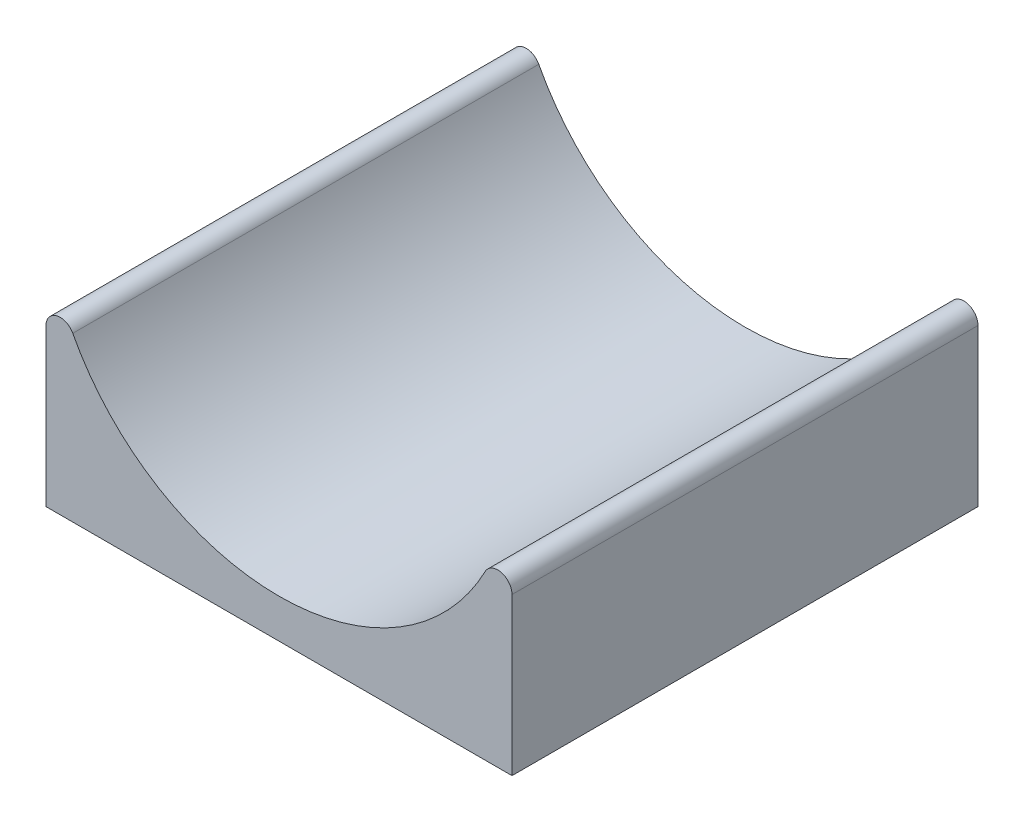
ISO-10303-21;
HEADER;
FILE_DESCRIPTION(('STEP AP214'),'2;1');
FILE_NAME('part.step','',(''),(''),'','','');
FILE_SCHEMA(('AUTOMOTIVE_DESIGN { 1 0 10303 214 1 1 1 1 }'));
ENDSEC;
DATA;
#1=APPLICATION_CONTEXT('core data for automotive mechanical design processes');
#2=APPLICATION_PROTOCOL_DEFINITION('international standard','automotive_design',2000,#1);
#3=PRODUCT_CONTEXT('',#1,'mechanical');
#4=PRODUCT('Part','Part','',(#3));
#5=PRODUCT_RELATED_PRODUCT_CATEGORY('part','',(#4));
#6=PRODUCT_DEFINITION_FORMATION('','',#4);
#7=PRODUCT_DEFINITION_CONTEXT('part definition',#1,'design');
#8=PRODUCT_DEFINITION('design','',#6,#7);
#9=PRODUCT_DEFINITION_SHAPE('','',#8);
#10=(LENGTH_UNIT() NAMED_UNIT(*) SI_UNIT(.MILLI.,.METRE.));
#11=(NAMED_UNIT(*) PLANE_ANGLE_UNIT() SI_UNIT($,.RADIAN.));
#12=(NAMED_UNIT(*) SI_UNIT($,.STERADIAN.) SOLID_ANGLE_UNIT());
#13=UNCERTAINTY_MEASURE_WITH_UNIT(LENGTH_MEASURE(1.E-05),#10,'distance_accuracy_value','');
#14=(GEOMETRIC_REPRESENTATION_CONTEXT(3) GLOBAL_UNCERTAINTY_ASSIGNED_CONTEXT((#13)) GLOBAL_UNIT_ASSIGNED_CONTEXT((#10,
#11,#12)) REPRESENTATION_CONTEXT('',''));
#15=CARTESIAN_POINT('',(0.,0.,0.));
#16=DIRECTION('',(0.,0.,1.));
#17=DIRECTION('',(1.,0.,0.));
#18=AXIS2_PLACEMENT_3D('',#15,#16,#17);
#19=CARTESIAN_POINT('',(-19.558,-10.2862160195088,41.656));
#20=DIRECTION('',(0.,0.,-1.));
#21=DIRECTION('',(-1.,0.,0.));
#22=AXIS2_PLACEMENT_3D('',#19,#20,#21);
#23=CYLINDRICAL_SURFACE('',#22,1.27);
#24=CARTESIAN_POINT('',(-19.558,-10.2862160195088,0.));
#25=DIRECTION('',(0.,0.,1.));
#26=DIRECTION('',(-1.,0.,0.));
#27=AXIS2_PLACEMENT_3D('',#24,#25,#26);
#28=CIRCLE('',#27,1.27);
#29=CARTESIAN_POINT('',(-18.4339770114943,-9.69505417930716,0.));
#30=VERTEX_POINT('',#29);
#31=CARTESIAN_POINT('',(-20.828,-10.2862160195088,0.));
#32=VERTEX_POINT('',#31);
#33=EDGE_CURVE('E117',#30,#32,#28,.T.);
#34=ORIENTED_EDGE('',*,*,#33,.T.);
#35=DIRECTION('',(0.,0.,-1.));
#36=VECTOR('',#35,1.);
#37=CARTESIAN_POINT('',(-20.828,-10.2862160195088,41.656));
#38=LINE('',#37,#36);
#39=CARTESIAN_POINT('',(-20.828,-10.2862160195088,41.656));
#40=VERTEX_POINT('',#39);
#41=EDGE_CURVE('E11',#40,#32,#38,.T.);
#42=ORIENTED_EDGE('',*,*,#41,.F.);
#43=CARTESIAN_POINT('',(-19.558,-10.2862160195088,41.656));
#44=DIRECTION('',(0.,0.,1.));
#45=DIRECTION('',(-1.,0.,0.));
#46=AXIS2_PLACEMENT_3D('',#43,#44,#45);
#47=CIRCLE('',#46,1.27);
#48=CARTESIAN_POINT('',(-18.4339770114943,-9.69505417930716,41.656));
#49=VERTEX_POINT('',#48);
#50=EDGE_CURVE('E127',#49,#40,#47,.T.);
#51=ORIENTED_EDGE('',*,*,#50,.F.);
#52=DIRECTION('',(0.,0.,-1.));
#53=VECTOR('',#52,1.);
#54=CARTESIAN_POINT('',(-18.4339770114943,-9.69505417930716,41.656));
#55=LINE('',#54,#53);
#56=EDGE_CURVE('E113',#49,#30,#55,.T.);
#57=ORIENTED_EDGE('',*,*,#56,.T.);
#58=EDGE_LOOP('',(#34,#42,#51,#57));
#59=FACE_BOUND('',#58,.T.);
#60=ADVANCED_FACE('F33',(#59),#23,.T.);
#61=CARTESIAN_POINT('',(-20.828,-10.2862160195088,41.656));
#62=DIRECTION('',(1.,0.,0.));
#63=DIRECTION('',(0.,0.,-1.));
#64=AXIS2_PLACEMENT_3D('',#61,#62,#63);
#65=PLANE('',#64);
#66=DIRECTION('',(0.,-1.,0.));
#67=VECTOR('',#66,1.);
#68=CARTESIAN_POINT('',(-20.828,-10.2862160195088,0.));
#69=LINE('',#68,#67);
#70=CARTESIAN_POINT('',(-20.828,-24.3086232060066,0.));
#71=VERTEX_POINT('',#70);
#72=EDGE_CURVE('E120',#32,#71,#69,.T.);
#73=ORIENTED_EDGE('',*,*,#72,.T.);
#74=DIRECTION('',(0.,0.,-1.));
#75=VECTOR('',#74,1.);
#76=CARTESIAN_POINT('',(-20.828,-24.3086232060066,41.656));
#77=LINE('',#76,#75);
#78=CARTESIAN_POINT('',(-20.828,-24.3086232060066,41.656));
#79=VERTEX_POINT('',#78);
#80=EDGE_CURVE('E41',#79,#71,#77,.T.);
#81=ORIENTED_EDGE('',*,*,#80,.F.);
#82=DIRECTION('',(0.,-1.,0.));
#83=VECTOR('',#82,1.);
#84=CARTESIAN_POINT('',(-20.828,-10.2862160195088,41.656));
#85=LINE('',#84,#83);
#86=EDGE_CURVE('E86',#40,#79,#85,.T.);
#87=ORIENTED_EDGE('',*,*,#86,.F.);
#88=ORIENTED_EDGE('',*,*,#41,.T.);
#89=EDGE_LOOP('',(#73,#81,#87,#88));
#90=FACE_BOUND('',#89,.T.);
#91=ADVANCED_FACE('F151',(#90),#65,.F.);
#92=CARTESIAN_POINT('',(-20.828,-24.3086232060066,41.656));
#93=DIRECTION('',(0.,1.,0.));
#94=DIRECTION('',(0.,0.,1.));
#95=AXIS2_PLACEMENT_3D('',#92,#93,#94);
#96=PLANE('',#95);
#97=DIRECTION('',(1.,0.,0.));
#98=VECTOR('',#97,1.);
#99=CARTESIAN_POINT('',(-20.828,-24.3086232060066,0.));
#100=LINE('',#99,#98);
#101=CARTESIAN_POINT('',(20.828,-24.3086232060066,0.));
#102=VERTEX_POINT('',#101);
#103=EDGE_CURVE('E122',#71,#102,#100,.T.);
#104=ORIENTED_EDGE('',*,*,#103,.T.);
#105=DIRECTION('',(0.,0.,-1.));
#106=VECTOR('',#105,1.);
#107=CARTESIAN_POINT('',(20.828,-24.3086232060066,41.656));
#108=LINE('',#107,#106);
#109=CARTESIAN_POINT('',(20.828,-24.3086232060066,41.656));
#110=VERTEX_POINT('',#109);
#111=EDGE_CURVE('E108',#110,#102,#108,.T.);
#112=ORIENTED_EDGE('',*,*,#111,.F.);
#113=DIRECTION('',(1.,0.,0.));
#114=VECTOR('',#113,1.);
#115=CARTESIAN_POINT('',(-20.828,-24.3086232060066,41.656));
#116=LINE('',#115,#114);
#117=EDGE_CURVE('E99',#79,#110,#116,.T.);
#118=ORIENTED_EDGE('',*,*,#117,.F.);
#119=ORIENTED_EDGE('',*,*,#80,.T.);
#120=EDGE_LOOP('',(#104,#112,#118,#119));
#121=FACE_BOUND('',#120,.T.);
#122=ADVANCED_FACE('F133',(#121),#96,.F.);
#123=CARTESIAN_POINT('',(20.828,-24.3086232060066,41.656));
#124=DIRECTION('',(-1.,0.,0.));
#125=DIRECTION('',(0.,0.,1.));
#126=AXIS2_PLACEMENT_3D('',#123,#124,#125);
#127=PLANE('',#126);
#128=DIRECTION('',(0.,1.,0.));
#129=VECTOR('',#128,1.);
#130=CARTESIAN_POINT('',(20.828,-24.3086232060066,0.));
#131=LINE('',#130,#129);
#132=CARTESIAN_POINT('',(20.828,-10.2862160195088,0.));
#133=VERTEX_POINT('',#132);
#134=EDGE_CURVE('E107',#102,#133,#131,.T.);
#135=ORIENTED_EDGE('',*,*,#134,.T.);
#136=DIRECTION('',(0.,0.,-1.));
#137=VECTOR('',#136,1.);
#138=CARTESIAN_POINT('',(20.828,-10.2862160195088,41.656));
#139=LINE('',#138,#137);
#140=CARTESIAN_POINT('',(20.828,-10.2862160195088,41.656));
#141=VERTEX_POINT('',#140);
#142=EDGE_CURVE('E104',#141,#133,#139,.T.);
#143=ORIENTED_EDGE('',*,*,#142,.F.);
#144=DIRECTION('',(0.,1.,0.));
#145=VECTOR('',#144,1.);
#146=CARTESIAN_POINT('',(20.828,-24.3086232060066,41.656));
#147=LINE('',#146,#145);
#148=EDGE_CURVE('E93',#110,#141,#147,.T.);
#149=ORIENTED_EDGE('',*,*,#148,.F.);
#150=ORIENTED_EDGE('',*,*,#111,.T.);
#151=EDGE_LOOP('',(#135,#143,#149,#150));
#152=FACE_BOUND('',#151,.T.);
#153=ADVANCED_FACE('F105',(#152),#127,.F.);
#154=CARTESIAN_POINT('',(19.558,-10.2862160195088,41.656));
#155=DIRECTION('',(0.,0.,-1.));
#156=DIRECTION('',(-1.,0.,0.));
#157=AXIS2_PLACEMENT_3D('',#154,#155,#156);
#158=CYLINDRICAL_SURFACE('',#157,1.27);
#159=CARTESIAN_POINT('',(19.558,-10.2862160195088,0.));
#160=DIRECTION('',(0.,0.,1.));
#161=DIRECTION('',(1.,0.,0.));
#162=AXIS2_PLACEMENT_3D('',#159,#160,#161);
#163=CIRCLE('',#162,1.27);
#164=CARTESIAN_POINT('',(18.4339770114942,-9.69505417930717,0.));
#165=VERTEX_POINT('',#164);
#166=EDGE_CURVE('E72',#133,#165,#163,.T.);
#167=ORIENTED_EDGE('',*,*,#166,.T.);
#168=DIRECTION('',(0.,0.,-1.));
#169=VECTOR('',#168,1.);
#170=CARTESIAN_POINT('',(18.4339770114942,-9.69505417930717,41.656));
#171=LINE('',#170,#169);
#172=CARTESIAN_POINT('',(18.4339770114942,-9.69505417930717,41.656));
#173=VERTEX_POINT('',#172);
#174=EDGE_CURVE('E109',#173,#165,#171,.T.);
#175=ORIENTED_EDGE('',*,*,#174,.F.);
#176=CARTESIAN_POINT('',(19.558,-10.2862160195088,41.656));
#177=DIRECTION('',(0.,0.,1.));
#178=DIRECTION('',(1.,0.,0.));
#179=AXIS2_PLACEMENT_3D('',#176,#177,#178);
#180=CIRCLE('',#179,1.27);
#181=EDGE_CURVE('E97',#141,#173,#180,.T.);
#182=ORIENTED_EDGE('',*,*,#181,.F.);
#183=ORIENTED_EDGE('',*,*,#142,.T.);
#184=EDGE_LOOP('',(#167,#175,#182,#183));
#185=FACE_BOUND('',#184,.T.);
#186=ADVANCED_FACE('F111',(#185),#158,.T.);
#187=CARTESIAN_POINT('',(0.,0.,41.656));
#188=DIRECTION('',(0.,0.,-1.));
#189=DIRECTION('',(-1.,0.,0.));
#190=AXIS2_PLACEMENT_3D('',#187,#188,#189);
#191=CYLINDRICAL_SURFACE('',#190,20.828);
#192=CARTESIAN_POINT('',(0.,0.,0.));
#193=DIRECTION('',(0.,0.,-1.));
#194=DIRECTION('',(1.,0.,0.));
#195=AXIS2_PLACEMENT_3D('',#192,#193,#194);
#196=CIRCLE('',#195,20.828);
#197=EDGE_CURVE('E78',#165,#30,#196,.T.);
#198=ORIENTED_EDGE('',*,*,#197,.T.);
#199=ORIENTED_EDGE('',*,*,#56,.F.);
#200=CARTESIAN_POINT('',(0.,0.,41.656));
#201=DIRECTION('',(0.,0.,-1.));
#202=DIRECTION('',(1.,0.,0.));
#203=AXIS2_PLACEMENT_3D('',#200,#201,#202);
#204=CIRCLE('',#203,20.828);
#205=EDGE_CURVE('E49',#173,#49,#204,.T.);
#206=ORIENTED_EDGE('',*,*,#205,.F.);
#207=ORIENTED_EDGE('',*,*,#174,.T.);
#208=EDGE_LOOP('',(#198,#199,#206,#207));
#209=FACE_BOUND('',#208,.T.);
#210=ADVANCED_FACE('F140',(#209),#191,.F.);
#211=CARTESIAN_POINT('',(-19.558,-10.2862160195088,41.656));
#212=DIRECTION('',(0.,0.,-1.));
#213=DIRECTION('',(-1.,0.,0.));
#214=AXIS2_PLACEMENT_3D('',#211,#212,#213);
#215=PLANE('',#214);
#216=ORIENTED_EDGE('',*,*,#50,.T.);
#217=ORIENTED_EDGE('',*,*,#86,.T.);
#218=ORIENTED_EDGE('',*,*,#117,.T.);
#219=ORIENTED_EDGE('',*,*,#148,.T.);
#220=ORIENTED_EDGE('',*,*,#181,.T.);
#221=ORIENTED_EDGE('',*,*,#205,.T.);
#222=EDGE_LOOP('',(#216,#217,#218,#219,#220,#221));
#223=FACE_BOUND('',#222,.T.);
#224=ADVANCED_FACE('F95',(#223),#215,.F.);
#225=CARTESIAN_POINT('',(-19.558,-10.2862160195088,0.));
#226=DIRECTION('',(0.,0.,-1.));
#227=DIRECTION('',(-1.,0.,0.));
#228=AXIS2_PLACEMENT_3D('',#225,#226,#227);
#229=PLANE('',#228);
#230=ORIENTED_EDGE('',*,*,#33,.F.);
#231=ORIENTED_EDGE('',*,*,#197,.F.);
#232=ORIENTED_EDGE('',*,*,#166,.F.);
#233=ORIENTED_EDGE('',*,*,#134,.F.);
#234=ORIENTED_EDGE('',*,*,#103,.F.);
#235=ORIENTED_EDGE('',*,*,#72,.F.);
#236=EDGE_LOOP('',(#230,#231,#232,#233,#234,#235));
#237=FACE_BOUND('',#236,.T.);
#238=ADVANCED_FACE('F136',(#237),#229,.T.);
#239=CLOSED_SHELL('',(#60,#91,#122,#153,#186,#210,#224,#238));
#240=MANIFOLD_SOLID_BREP('B2',#239);
#241=ADVANCED_BREP_SHAPE_REPRESENTATION('',(#18,#240),#14);
#242=SHAPE_DEFINITION_REPRESENTATION(#9,#241);
ENDSEC;
END-ISO-10303-21;
